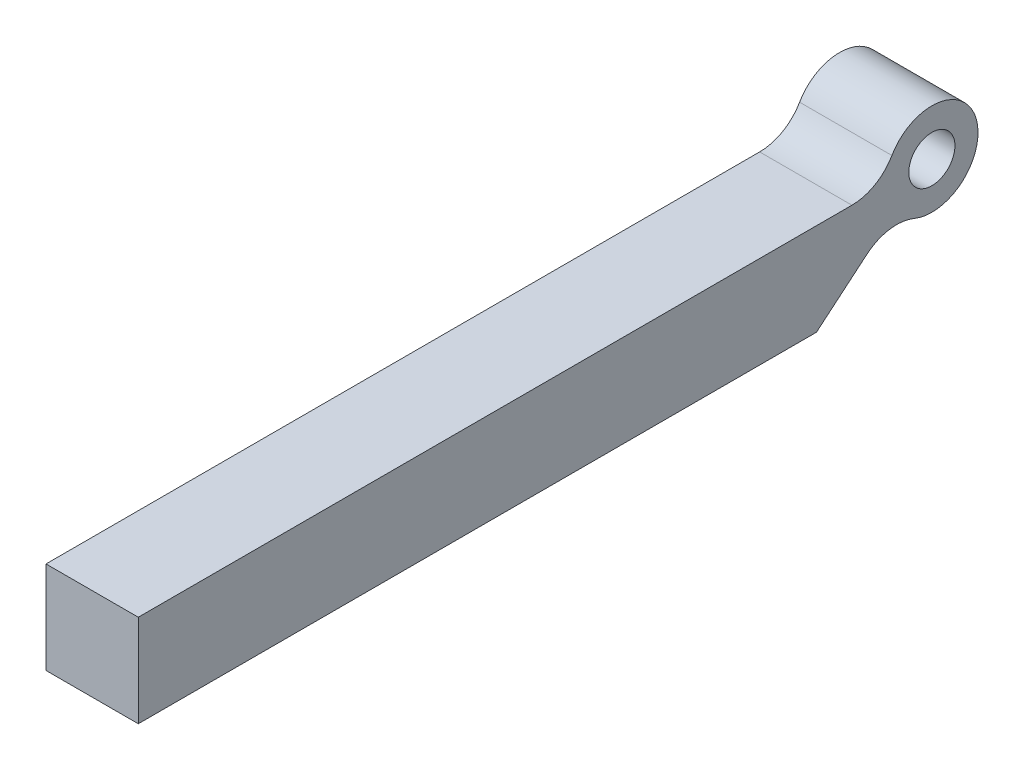
ISO-10303-21;
HEADER;
FILE_DESCRIPTION(('STEP AP214'),'2;1');
FILE_NAME('part.step','',(''),(''),'','','');
FILE_SCHEMA(('AUTOMOTIVE_DESIGN { 1 0 10303 214 1 1 1 1 }'));
ENDSEC;
DATA;
#1=APPLICATION_CONTEXT('core data for automotive mechanical design processes');
#2=APPLICATION_PROTOCOL_DEFINITION('international standard','automotive_design',2000,#1);
#3=PRODUCT_CONTEXT('',#1,'mechanical');
#4=PRODUCT('Part','Part','',(#3));
#5=PRODUCT_RELATED_PRODUCT_CATEGORY('part','',(#4));
#6=PRODUCT_DEFINITION_FORMATION('','',#4);
#7=PRODUCT_DEFINITION_CONTEXT('part definition',#1,'design');
#8=PRODUCT_DEFINITION('design','',#6,#7);
#9=PRODUCT_DEFINITION_SHAPE('','',#8);
#10=(LENGTH_UNIT() NAMED_UNIT(*) SI_UNIT(.MILLI.,.METRE.));
#11=(NAMED_UNIT(*) PLANE_ANGLE_UNIT() SI_UNIT($,.RADIAN.));
#12=(NAMED_UNIT(*) SI_UNIT($,.STERADIAN.) SOLID_ANGLE_UNIT());
#13=UNCERTAINTY_MEASURE_WITH_UNIT(LENGTH_MEASURE(1.E-05),#10,'distance_accuracy_value','');
#14=(GEOMETRIC_REPRESENTATION_CONTEXT(3) GLOBAL_UNCERTAINTY_ASSIGNED_CONTEXT((#13)) GLOBAL_UNIT_ASSIGNED_CONTEXT((#10,
#11,#12)) REPRESENTATION_CONTEXT('',''));
#15=CARTESIAN_POINT('',(0.,0.,0.));
#16=DIRECTION('',(0.,0.,1.));
#17=DIRECTION('',(1.,0.,0.));
#18=AXIS2_PLACEMENT_3D('',#15,#16,#17);
#19=CARTESIAN_POINT('',(-2.,2.82842712474617,37.2212425586298));
#20=DIRECTION('',(0.,0.,1.));
#21=DIRECTION('',(1.,0.,0.));
#22=AXIS2_PLACEMENT_3D('',#19,#20,#21);
#23=PLANE('',#22);
#24=DIRECTION('',(1.,0.,0.));
#25=VECTOR('',#24,1.);
#26=CARTESIAN_POINT('',(-2.,-1.17157287525383,37.2212425586298));
#27=LINE('',#26,#25);
#28=CARTESIAN_POINT('',(-2.,-1.17157287525383,37.2212425586298));
#29=VERTEX_POINT('',#28);
#30=CARTESIAN_POINT('',(2.,-1.17157287525383,37.2212425586298));
#31=VERTEX_POINT('',#30);
#32=EDGE_CURVE('E40',#29,#31,#27,.T.);
#33=ORIENTED_EDGE('',*,*,#32,.T.);
#34=DIRECTION('',(0.,-1.,0.));
#35=VECTOR('',#34,1.);
#36=CARTESIAN_POINT('',(2.,2.82842712474617,37.2212425586298));
#37=LINE('',#36,#35);
#38=CARTESIAN_POINT('',(2.,2.82842712474617,37.2212425586298));
#39=VERTEX_POINT('',#38);
#40=EDGE_CURVE('E95',#39,#31,#37,.T.);
#41=ORIENTED_EDGE('',*,*,#40,.F.);
#42=DIRECTION('',(1.,0.,0.));
#43=VECTOR('',#42,1.);
#44=CARTESIAN_POINT('',(-2.,2.82842712474617,37.2212425586298));
#45=LINE('',#44,#43);
#46=CARTESIAN_POINT('',(-2.,2.82842712474617,37.2212425586298));
#47=VERTEX_POINT('',#46);
#48=EDGE_CURVE('E11',#47,#39,#45,.T.);
#49=ORIENTED_EDGE('',*,*,#48,.F.);
#50=DIRECTION('',(0.,-1.,0.));
#51=VECTOR('',#50,1.);
#52=CARTESIAN_POINT('',(-2.,2.82842712474617,37.2212425586298));
#53=LINE('',#52,#51);
#54=EDGE_CURVE('E96',#47,#29,#53,.T.);
#55=ORIENTED_EDGE('',*,*,#54,.T.);
#56=EDGE_LOOP('',(#33,#41,#49,#55));
#57=FACE_BOUND('',#56,.T.);
#58=ADVANCED_FACE('F37',(#57),#23,.T.);
#59=CARTESIAN_POINT('',(-2.,2.82842712474617,6.29252873988396));
#60=DIRECTION('',(0.,1.,0.));
#61=DIRECTION('',(0.,0.,1.));
#62=AXIS2_PLACEMENT_3D('',#59,#60,#61);
#63=PLANE('',#62);
#64=ORIENTED_EDGE('',*,*,#48,.T.);
#65=DIRECTION('',(0.,0.,1.));
#66=VECTOR('',#65,1.);
#67=CARTESIAN_POINT('',(2.,2.82842712474617,6.29252873988396));
#68=LINE('',#67,#66);
#69=CARTESIAN_POINT('',(2.,2.82842712474617,6.29252873988396));
#70=VERTEX_POINT('',#69);
#71=EDGE_CURVE('E114',#70,#39,#68,.T.);
#72=ORIENTED_EDGE('',*,*,#71,.F.);
#73=DIRECTION('',(1.,0.,0.));
#74=VECTOR('',#73,1.);
#75=CARTESIAN_POINT('',(-2.,2.82842712474617,6.29252873988396));
#76=LINE('',#75,#74);
#77=CARTESIAN_POINT('',(-2.,2.82842712474617,6.29252873988396));
#78=VERTEX_POINT('',#77);
#79=EDGE_CURVE('E45',#78,#70,#76,.T.);
#80=ORIENTED_EDGE('',*,*,#79,.F.);
#81=DIRECTION('',(0.,0.,1.));
#82=VECTOR('',#81,1.);
#83=CARTESIAN_POINT('',(-2.,2.82842712474617,6.29252873988396));
#84=LINE('',#83,#82);
#85=EDGE_CURVE('E101',#78,#47,#84,.T.);
#86=ORIENTED_EDGE('',*,*,#85,.T.);
#87=EDGE_LOOP('',(#64,#72,#80,#86));
#88=FACE_BOUND('',#87,.T.);
#89=ADVANCED_FACE('F172',(#88),#63,.T.);
#90=CARTESIAN_POINT('',(-2.,4.82842712474617,6.29252873988396));
#91=DIRECTION('',(1.,0.,0.));
#92=DIRECTION('',(0.,0.,-1.));
#93=AXIS2_PLACEMENT_3D('',#90,#91,#92);
#94=CYLINDRICAL_SURFACE('',#93,2.);
#95=ORIENTED_EDGE('',*,*,#79,.T.);
#96=CARTESIAN_POINT('',(2.,4.82842712474617,6.29252873988396));
#97=DIRECTION('',(-1.,0.,0.));
#98=DIRECTION('',(0.,0.,-1.));
#99=AXIS2_PLACEMENT_3D('',#96,#97,#98);
#100=CIRCLE('',#99,2.);
#101=CARTESIAN_POINT('',(2.,3.82842712474617,4.56047793231508));
#102=VERTEX_POINT('',#101);
#103=EDGE_CURVE('E127',#102,#70,#100,.T.);
#104=ORIENTED_EDGE('',*,*,#103,.F.);
#105=DIRECTION('',(1.,0.,0.));
#106=VECTOR('',#105,1.);
#107=CARTESIAN_POINT('',(-2.,3.82842712474617,4.56047793231508));
#108=LINE('',#107,#106);
#109=CARTESIAN_POINT('',(-2.,3.82842712474617,4.56047793231508));
#110=VERTEX_POINT('',#109);
#111=EDGE_CURVE('E149',#110,#102,#108,.T.);
#112=ORIENTED_EDGE('',*,*,#111,.F.);
#113=CARTESIAN_POINT('',(-2.,4.82842712474617,6.29252873988396));
#114=DIRECTION('',(-1.,0.,0.));
#115=DIRECTION('',(0.,0.,-1.));
#116=AXIS2_PLACEMENT_3D('',#113,#114,#115);
#117=CIRCLE('',#116,2.);
#118=EDGE_CURVE('E145',#110,#78,#117,.T.);
#119=ORIENTED_EDGE('',*,*,#118,.T.);
#120=EDGE_LOOP('',(#95,#104,#112,#119));
#121=FACE_BOUND('',#120,.T.);
#122=ADVANCED_FACE('F170',(#121),#94,.F.);
#123=CARTESIAN_POINT('',(-2.,2.82842712474617,2.82842712474621));
#124=DIRECTION('',(1.,0.,0.));
#125=DIRECTION('',(0.,0.,-1.));
#126=AXIS2_PLACEMENT_3D('',#123,#124,#125);
#127=CYLINDRICAL_SURFACE('',#126,2.);
#128=ORIENTED_EDGE('',*,*,#111,.T.);
#129=CARTESIAN_POINT('',(2.,2.82842712474617,2.82842712474621));
#130=DIRECTION('',(1.,0.,0.));
#131=DIRECTION('',(0.,0.,-1.));
#132=AXIS2_PLACEMENT_3D('',#129,#130,#131);
#133=CIRCLE('',#132,2.);
#134=CARTESIAN_POINT('',(2.,0.979968611984142,3.59210318604286));
#135=VERTEX_POINT('',#134);
#136=EDGE_CURVE('E124',#135,#102,#133,.T.);
#137=ORIENTED_EDGE('',*,*,#136,.F.);
#138=DIRECTION('',(1.,0.,0.));
#139=VECTOR('',#138,1.);
#140=CARTESIAN_POINT('',(-2.,0.979968611984142,3.59210318604286));
#141=LINE('',#140,#139);
#142=CARTESIAN_POINT('',(-2.,0.979968611984142,3.59210318604286));
#143=VERTEX_POINT('',#142);
#144=EDGE_CURVE('E151',#143,#135,#141,.T.);
#145=ORIENTED_EDGE('',*,*,#144,.F.);
#146=CARTESIAN_POINT('',(-2.,2.82842712474617,2.82842712474621));
#147=DIRECTION('',(1.,0.,0.));
#148=DIRECTION('',(0.,0.,-1.));
#149=AXIS2_PLACEMENT_3D('',#146,#147,#148);
#150=CIRCLE('',#149,2.);
#151=EDGE_CURVE('E142',#143,#110,#150,.T.);
#152=ORIENTED_EDGE('',*,*,#151,.T.);
#153=EDGE_LOOP('',(#128,#137,#145,#152));
#154=FACE_BOUND('',#153,.T.);
#155=ADVANCED_FACE('F164',(#154),#127,.T.);
#156=CARTESIAN_POINT('',(-2.,-0.868489900777891,4.35577924733952));
#157=DIRECTION('',(1.,0.,0.));
#158=DIRECTION('',(0.,0.,-1.));
#159=AXIS2_PLACEMENT_3D('',#156,#157,#158);
#160=CYLINDRICAL_SURFACE('',#159,2.);
#161=ORIENTED_EDGE('',*,*,#144,.T.);
#162=CARTESIAN_POINT('',(2.,-0.868489900777891,4.35577924733952));
#163=DIRECTION('',(-1.,0.,0.));
#164=DIRECTION('',(0.,0.,-1.));
#165=AXIS2_PLACEMENT_3D('',#162,#163,#164);
#166=CIRCLE('',#165,2.);
#167=CARTESIAN_POINT('',(2.,0.663598985460072,5.64135446671259));
#168=VERTEX_POINT('',#167);
#169=EDGE_CURVE('E121',#168,#135,#166,.T.);
#170=ORIENTED_EDGE('',*,*,#169,.F.);
#171=DIRECTION('',(1.,0.,0.));
#172=VECTOR('',#171,1.);
#173=CARTESIAN_POINT('',(-2.,0.663598985460072,5.64135446671259));
#174=LINE('',#173,#172);
#175=CARTESIAN_POINT('',(-2.,0.663598985460072,5.64135446671259));
#176=VERTEX_POINT('',#175);
#177=EDGE_CURVE('E153',#176,#168,#174,.T.);
#178=ORIENTED_EDGE('',*,*,#177,.F.);
#179=CARTESIAN_POINT('',(-2.,-0.868489900777891,4.35577924733952));
#180=DIRECTION('',(-1.,0.,0.));
#181=DIRECTION('',(0.,0.,-1.));
#182=AXIS2_PLACEMENT_3D('',#179,#180,#181);
#183=CIRCLE('',#182,2.);
#184=EDGE_CURVE('E139',#176,#143,#183,.T.);
#185=ORIENTED_EDGE('',*,*,#184,.T.);
#186=EDGE_LOOP('',(#161,#170,#178,#185));
#187=FACE_BOUND('',#186,.T.);
#188=ADVANCED_FACE('F161',(#187),#160,.F.);
#189=CARTESIAN_POINT('',(-2.,-1.17157287525383,7.8284271247462));
#190=DIRECTION('',(0.,-0.766044443118982,-0.642787609686535));
#191=DIRECTION('',(0.,0.642787609686535,-0.766044443118981));
#192=AXIS2_PLACEMENT_3D('',#189,#190,#191);
#193=PLANE('',#192);
#194=ORIENTED_EDGE('',*,*,#177,.T.);
#195=DIRECTION('',(0.,0.642787609686535,-0.766044443118981));
#196=VECTOR('',#195,1.);
#197=CARTESIAN_POINT('',(2.,-1.17157287525383,7.8284271247462));
#198=LINE('',#197,#196);
#199=CARTESIAN_POINT('',(2.,-1.17157287525383,7.8284271247462));
#200=VERTEX_POINT('',#199);
#201=EDGE_CURVE('E108',#200,#168,#198,.T.);
#202=ORIENTED_EDGE('',*,*,#201,.F.);
#203=DIRECTION('',(1.,0.,0.));
#204=VECTOR('',#203,1.);
#205=CARTESIAN_POINT('',(-2.,-1.17157287525383,7.8284271247462));
#206=LINE('',#205,#204);
#207=CARTESIAN_POINT('',(-2.,-1.17157287525383,7.8284271247462));
#208=VERTEX_POINT('',#207);
#209=EDGE_CURVE('E100',#208,#200,#206,.T.);
#210=ORIENTED_EDGE('',*,*,#209,.F.);
#211=DIRECTION('',(0.,0.642787609686535,-0.766044443118981));
#212=VECTOR('',#211,1.);
#213=CARTESIAN_POINT('',(-2.,-1.17157287525383,7.8284271247462));
#214=LINE('',#213,#212);
#215=EDGE_CURVE('E136',#208,#176,#214,.T.);
#216=ORIENTED_EDGE('',*,*,#215,.T.);
#217=EDGE_LOOP('',(#194,#202,#210,#216));
#218=FACE_BOUND('',#217,.T.);
#219=ADVANCED_FACE('F155',(#218),#193,.T.);
#220=CARTESIAN_POINT('',(-2.,-1.17157287525383,7.8284271247462));
#221=DIRECTION('',(0.,-1.,0.));
#222=DIRECTION('',(0.,0.,-1.));
#223=AXIS2_PLACEMENT_3D('',#220,#221,#222);
#224=PLANE('',#223);
#225=ORIENTED_EDGE('',*,*,#209,.T.);
#226=DIRECTION('',(0.,0.,-1.));
#227=VECTOR('',#226,1.);
#228=CARTESIAN_POINT('',(2.,-1.17157287525383,7.8284271247462));
#229=LINE('',#228,#227);
#230=EDGE_CURVE('E103',#31,#200,#229,.T.);
#231=ORIENTED_EDGE('',*,*,#230,.F.);
#232=ORIENTED_EDGE('',*,*,#32,.F.);
#233=DIRECTION('',(0.,0.,-1.));
#234=VECTOR('',#233,1.);
#235=CARTESIAN_POINT('',(-2.,-1.17157287525383,7.8284271247462));
#236=LINE('',#235,#234);
#237=EDGE_CURVE('E134',#29,#208,#236,.T.);
#238=ORIENTED_EDGE('',*,*,#237,.T.);
#239=EDGE_LOOP('',(#225,#231,#232,#238));
#240=FACE_BOUND('',#239,.T.);
#241=ADVANCED_FACE('F104',(#240),#224,.T.);
#242=CARTESIAN_POINT('',(-2.,-0.868489900777891,4.35577924733952));
#243=DIRECTION('',(1.,0.,0.));
#244=DIRECTION('',(0.,0.,-1.));
#245=AXIS2_PLACEMENT_3D('',#242,#243,#244);
#246=PLANE('',#245);
#247=CARTESIAN_POINT('',(-2.,2.82842712474617,2.82842712474621));
#248=DIRECTION('',(1.,0.,0.));
#249=DIRECTION('',(0.,0.,-1.));
#250=AXIS2_PLACEMENT_3D('',#247,#248,#249);
#251=CIRCLE('',#250,1.);
#252=CARTESIAN_POINT('',(-2.,2.82842712474617,1.82842712474621));
#253=VERTEX_POINT('',#252);
#254=EDGE_CURVE('E130',#253,#253,#251,.T.);
#255=ORIENTED_EDGE('',*,*,#254,.T.);
#256=EDGE_LOOP('',(#255));
#257=FACE_BOUND('',#256,.T.);
#258=ORIENTED_EDGE('',*,*,#54,.F.);
#259=ORIENTED_EDGE('',*,*,#85,.F.);
#260=ORIENTED_EDGE('',*,*,#118,.F.);
#261=ORIENTED_EDGE('',*,*,#151,.F.);
#262=ORIENTED_EDGE('',*,*,#184,.F.);
#263=ORIENTED_EDGE('',*,*,#215,.F.);
#264=ORIENTED_EDGE('',*,*,#237,.F.);
#265=EDGE_LOOP('',(#258,#259,#260,#261,#262,#263,#264));
#266=FACE_BOUND('',#265,.T.);
#267=ADVANCED_FACE('F167',(#257,#266),#246,.F.);
#268=CARTESIAN_POINT('',(-2.,2.82842712474617,2.82842712474621));
#269=DIRECTION('',(1.,0.,0.));
#270=DIRECTION('',(0.,0.,-1.));
#271=AXIS2_PLACEMENT_3D('',#268,#269,#270);
#272=CYLINDRICAL_SURFACE('',#271,1.);
#273=ORIENTED_EDGE('',*,*,#254,.F.);
#274=EDGE_LOOP('',(#273));
#275=FACE_BOUND('',#274,.T.);
#276=CARTESIAN_POINT('',(2.,2.82842712474617,2.82842712474621));
#277=DIRECTION('',(1.,0.,0.));
#278=DIRECTION('',(0.,0.,-1.));
#279=AXIS2_PLACEMENT_3D('',#276,#277,#278);
#280=CIRCLE('',#279,1.);
#281=CARTESIAN_POINT('',(2.,2.82842712474617,1.82842712474621));
#282=VERTEX_POINT('',#281);
#283=EDGE_CURVE('E115',#282,#282,#280,.T.);
#284=ORIENTED_EDGE('',*,*,#283,.T.);
#285=EDGE_LOOP('',(#284));
#286=FACE_BOUND('',#285,.T.);
#287=ADVANCED_FACE('F192',(#275,#286),#272,.F.);
#288=CARTESIAN_POINT('',(2.,-0.868489900777891,4.35577924733952));
#289=DIRECTION('',(1.,0.,0.));
#290=DIRECTION('',(0.,0.,-1.));
#291=AXIS2_PLACEMENT_3D('',#288,#289,#290);
#292=PLANE('',#291);
#293=ORIENTED_EDGE('',*,*,#40,.T.);
#294=ORIENTED_EDGE('',*,*,#230,.T.);
#295=ORIENTED_EDGE('',*,*,#201,.T.);
#296=ORIENTED_EDGE('',*,*,#169,.T.);
#297=ORIENTED_EDGE('',*,*,#136,.T.);
#298=ORIENTED_EDGE('',*,*,#103,.T.);
#299=ORIENTED_EDGE('',*,*,#71,.T.);
#300=EDGE_LOOP('',(#293,#294,#295,#296,#297,#298,#299));
#301=FACE_BOUND('',#300,.T.);
#302=ORIENTED_EDGE('',*,*,#283,.F.);
#303=EDGE_LOOP('',(#302));
#304=FACE_BOUND('',#303,.T.);
#305=ADVANCED_FACE('F111',(#301,#304),#292,.T.);
#306=CLOSED_SHELL('',(#58,#89,#122,#155,#188,#219,#241,#267,#287,#305));
#307=MANIFOLD_SOLID_BREP('B2',#306);
#308=ADVANCED_BREP_SHAPE_REPRESENTATION('',(#18,#307),#14);
#309=SHAPE_DEFINITION_REPRESENTATION(#9,#308);
ENDSEC;
END-ISO-10303-21;
